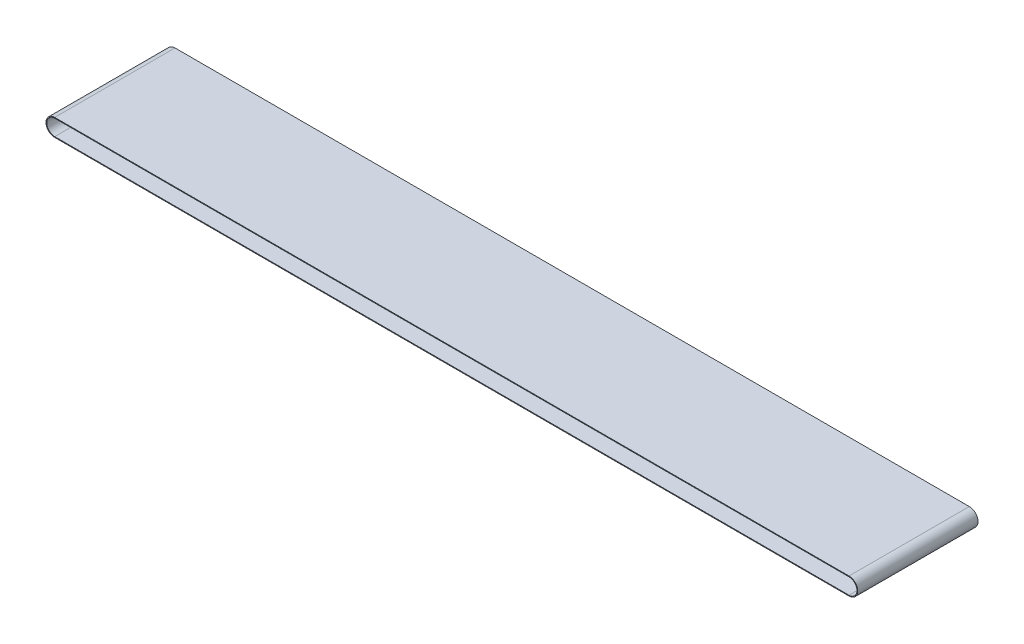
ISO-10303-21;
HEADER;
FILE_DESCRIPTION(('STEP AP214'),'2;1');
FILE_NAME('part.step','',(''),(''),'','','');
FILE_SCHEMA(('AUTOMOTIVE_DESIGN { 1 0 10303 214 1 1 1 1 }'));
ENDSEC;
DATA;
#1=APPLICATION_CONTEXT('core data for automotive mechanical design processes');
#2=APPLICATION_PROTOCOL_DEFINITION('international standard','automotive_design',2000,#1);
#3=PRODUCT_CONTEXT('',#1,'mechanical');
#4=PRODUCT('Part','Part','',(#3));
#5=PRODUCT_RELATED_PRODUCT_CATEGORY('part','',(#4));
#6=PRODUCT_DEFINITION_FORMATION('','',#4);
#7=PRODUCT_DEFINITION_CONTEXT('part definition',#1,'design');
#8=PRODUCT_DEFINITION('design','',#6,#7);
#9=PRODUCT_DEFINITION_SHAPE('','',#8);
#10=(LENGTH_UNIT() NAMED_UNIT(*) SI_UNIT(.MILLI.,.METRE.));
#11=(NAMED_UNIT(*) PLANE_ANGLE_UNIT() SI_UNIT($,.RADIAN.));
#12=(NAMED_UNIT(*) SI_UNIT($,.STERADIAN.) SOLID_ANGLE_UNIT());
#13=UNCERTAINTY_MEASURE_WITH_UNIT(LENGTH_MEASURE(1.E-05),#10,'distance_accuracy_value','');
#14=(GEOMETRIC_REPRESENTATION_CONTEXT(3) GLOBAL_UNCERTAINTY_ASSIGNED_CONTEXT((#13)) GLOBAL_UNIT_ASSIGNED_CONTEXT((#10,
#11,#12)) REPRESENTATION_CONTEXT('',''));
#15=CARTESIAN_POINT('',(0.,0.,0.));
#16=DIRECTION('',(0.,0.,1.));
#17=DIRECTION('',(1.,0.,0.));
#18=AXIS2_PLACEMENT_3D('',#15,#16,#17);
#19=CARTESIAN_POINT('',(-525.,0.,79.5));
#20=DIRECTION('',(0.,0.,1.));
#21=DIRECTION('',(1.,0.,0.));
#22=AXIS2_PLACEMENT_3D('',#19,#20,#21);
#23=PLANE('',#22);
#24=CARTESIAN_POINT('',(-525.,0.,79.5));
#25=DIRECTION('',(0.,0.,1.));
#26=DIRECTION('',(1.,0.,0.));
#27=AXIS2_PLACEMENT_3D('',#24,#25,#26);
#28=CIRCLE('',#27,11.5);
#29=CARTESIAN_POINT('',(-525.,11.5,79.5));
#30=VERTEX_POINT('',#29);
#31=CARTESIAN_POINT('',(-525.,-11.5,79.5));
#32=VERTEX_POINT('',#31);
#33=EDGE_CURVE('E138',#30,#32,#28,.T.);
#34=ORIENTED_EDGE('',*,*,#33,.T.);
#35=DIRECTION('',(1.,0.,0.));
#36=VECTOR('',#35,1.);
#37=CARTESIAN_POINT('',(-525.,-11.5,79.5));
#38=LINE('',#37,#36);
#39=CARTESIAN_POINT('',(525.,-11.5,79.5));
#40=VERTEX_POINT('',#39);
#41=EDGE_CURVE('E141',#32,#40,#38,.T.);
#42=ORIENTED_EDGE('',*,*,#41,.T.);
#43=CARTESIAN_POINT('',(525.,0.,79.5));
#44=DIRECTION('',(0.,0.,1.));
#45=DIRECTION('',(1.,0.,0.));
#46=AXIS2_PLACEMENT_3D('',#43,#44,#45);
#47=CIRCLE('',#46,11.5);
#48=CARTESIAN_POINT('',(525.,11.5,79.5));
#49=VERTEX_POINT('',#48);
#50=EDGE_CURVE('E144',#40,#49,#47,.T.);
#51=ORIENTED_EDGE('',*,*,#50,.T.);
#52=DIRECTION('',(-1.,0.,0.));
#53=VECTOR('',#52,1.);
#54=CARTESIAN_POINT('',(-525.,11.5,79.5));
#55=LINE('',#54,#53);
#56=EDGE_CURVE('E146',#49,#30,#55,.T.);
#57=ORIENTED_EDGE('',*,*,#56,.T.);
#58=EDGE_LOOP('',(#34,#42,#51,#57));
#59=FACE_BOUND('',#58,.T.);
#60=DIRECTION('',(1.,0.,0.));
#61=VECTOR('',#60,1.);
#62=CARTESIAN_POINT('',(-525.,-10.5,79.5));
#63=LINE('',#62,#61);
#64=CARTESIAN_POINT('',(-525.,-10.5,79.5));
#65=VERTEX_POINT('',#64);
#66=CARTESIAN_POINT('',(525.,-10.5,79.5));
#67=VERTEX_POINT('',#66);
#68=EDGE_CURVE('E110',#65,#67,#63,.T.);
#69=ORIENTED_EDGE('',*,*,#68,.F.);
#70=CARTESIAN_POINT('',(-525.,0.,79.5));
#71=DIRECTION('',(0.,0.,1.));
#72=DIRECTION('',(1.,0.,0.));
#73=AXIS2_PLACEMENT_3D('',#70,#71,#72);
#74=CIRCLE('',#73,10.5);
#75=CARTESIAN_POINT('',(-525.,10.5,79.5));
#76=VERTEX_POINT('',#75);
#77=EDGE_CURVE('E102',#76,#65,#74,.T.);
#78=ORIENTED_EDGE('',*,*,#77,.F.);
#79=DIRECTION('',(-1.,0.,0.));
#80=VECTOR('',#79,1.);
#81=CARTESIAN_POINT('',(-525.,10.5,79.5));
#82=LINE('',#81,#80);
#83=CARTESIAN_POINT('',(525.,10.5,79.5));
#84=VERTEX_POINT('',#83);
#85=EDGE_CURVE('E124',#84,#76,#82,.T.);
#86=ORIENTED_EDGE('',*,*,#85,.F.);
#87=CARTESIAN_POINT('',(525.,0.,79.5));
#88=DIRECTION('',(0.,0.,1.));
#89=DIRECTION('',(1.,0.,0.));
#90=AXIS2_PLACEMENT_3D('',#87,#88,#89);
#91=CIRCLE('',#90,10.5);
#92=EDGE_CURVE('E122',#67,#84,#91,.T.);
#93=ORIENTED_EDGE('',*,*,#92,.F.);
#94=EDGE_LOOP('',(#69,#78,#86,#93));
#95=FACE_BOUND('',#94,.T.);
#96=ADVANCED_FACE('F37',(#59,#95),#23,.T.);
#97=CARTESIAN_POINT('',(-525.,0.,-79.5));
#98=DIRECTION('',(0.,0.,1.));
#99=DIRECTION('',(1.,0.,0.));
#100=AXIS2_PLACEMENT_3D('',#97,#98,#99);
#101=PLANE('',#100);
#102=CARTESIAN_POINT('',(-525.,0.,-79.5));
#103=DIRECTION('',(0.,0.,1.));
#104=DIRECTION('',(1.,0.,0.));
#105=AXIS2_PLACEMENT_3D('',#102,#103,#104);
#106=CIRCLE('',#105,11.5);
#107=CARTESIAN_POINT('',(-525.,11.5,-79.5));
#108=VERTEX_POINT('',#107);
#109=CARTESIAN_POINT('',(-525.,-11.5,-79.5));
#110=VERTEX_POINT('',#109);
#111=EDGE_CURVE('E118',#108,#110,#106,.T.);
#112=ORIENTED_EDGE('',*,*,#111,.F.);
#113=DIRECTION('',(-1.,0.,0.));
#114=VECTOR('',#113,1.);
#115=CARTESIAN_POINT('',(-525.,11.5,-79.5));
#116=LINE('',#115,#114);
#117=CARTESIAN_POINT('',(525.,11.5,-79.5));
#118=VERTEX_POINT('',#117);
#119=EDGE_CURVE('E142',#118,#108,#116,.T.);
#120=ORIENTED_EDGE('',*,*,#119,.F.);
#121=CARTESIAN_POINT('',(525.,0.,-79.5));
#122=DIRECTION('',(0.,0.,1.));
#123=DIRECTION('',(1.,0.,0.));
#124=AXIS2_PLACEMENT_3D('',#121,#122,#123);
#125=CIRCLE('',#124,11.5);
#126=CARTESIAN_POINT('',(525.,-11.5,-79.5));
#127=VERTEX_POINT('',#126);
#128=EDGE_CURVE('E153',#127,#118,#125,.T.);
#129=ORIENTED_EDGE('',*,*,#128,.F.);
#130=DIRECTION('',(1.,0.,0.));
#131=VECTOR('',#130,1.);
#132=CARTESIAN_POINT('',(-525.,-11.5,-79.5));
#133=LINE('',#132,#131);
#134=EDGE_CURVE('E151',#110,#127,#133,.T.);
#135=ORIENTED_EDGE('',*,*,#134,.F.);
#136=EDGE_LOOP('',(#112,#120,#129,#135));
#137=FACE_BOUND('',#136,.T.);
#138=CARTESIAN_POINT('',(-525.,0.,-79.5));
#139=DIRECTION('',(0.,0.,1.));
#140=DIRECTION('',(1.,0.,0.));
#141=AXIS2_PLACEMENT_3D('',#138,#139,#140);
#142=CIRCLE('',#141,10.5);
#143=CARTESIAN_POINT('',(-525.,10.5,-79.5));
#144=VERTEX_POINT('',#143);
#145=CARTESIAN_POINT('',(-525.,-10.5,-79.5));
#146=VERTEX_POINT('',#145);
#147=EDGE_CURVE('E60',#144,#146,#142,.T.);
#148=ORIENTED_EDGE('',*,*,#147,.T.);
#149=DIRECTION('',(1.,0.,0.));
#150=VECTOR('',#149,1.);
#151=CARTESIAN_POINT('',(-525.,-10.5,-79.5));
#152=LINE('',#151,#150);
#153=CARTESIAN_POINT('',(525.,-10.5,-79.5));
#154=VERTEX_POINT('',#153);
#155=EDGE_CURVE('E117',#146,#154,#152,.T.);
#156=ORIENTED_EDGE('',*,*,#155,.T.);
#157=CARTESIAN_POINT('',(525.,0.,-79.5));
#158=DIRECTION('',(0.,0.,1.));
#159=DIRECTION('',(1.,0.,0.));
#160=AXIS2_PLACEMENT_3D('',#157,#158,#159);
#161=CIRCLE('',#160,10.5);
#162=CARTESIAN_POINT('',(525.,10.5,-79.5));
#163=VERTEX_POINT('',#162);
#164=EDGE_CURVE('E130',#154,#163,#161,.T.);
#165=ORIENTED_EDGE('',*,*,#164,.T.);
#166=DIRECTION('',(-1.,0.,0.));
#167=VECTOR('',#166,1.);
#168=CARTESIAN_POINT('',(-525.,10.5,-79.5));
#169=LINE('',#168,#167);
#170=EDGE_CURVE('E111',#163,#144,#169,.T.);
#171=ORIENTED_EDGE('',*,*,#170,.T.);
#172=EDGE_LOOP('',(#148,#156,#165,#171));
#173=FACE_BOUND('',#172,.T.);
#174=ADVANCED_FACE('F171',(#137,#173),#101,.F.);
#175=CARTESIAN_POINT('',(-525.,0.,79.5));
#176=DIRECTION('',(0.,0.,-1.));
#177=DIRECTION('',(-1.,0.,0.));
#178=AXIS2_PLACEMENT_3D('',#175,#176,#177);
#179=CYLINDRICAL_SURFACE('',#178,11.5);
#180=ORIENTED_EDGE('',*,*,#111,.T.);
#181=DIRECTION('',(0.,0.,-1.));
#182=VECTOR('',#181,1.);
#183=CARTESIAN_POINT('',(-525.,-11.5,79.5));
#184=LINE('',#183,#182);
#185=EDGE_CURVE('E11',#32,#110,#184,.T.);
#186=ORIENTED_EDGE('',*,*,#185,.F.);
#187=ORIENTED_EDGE('',*,*,#33,.F.);
#188=DIRECTION('',(0.,0.,-1.));
#189=VECTOR('',#188,1.);
#190=CARTESIAN_POINT('',(-525.,11.5,79.5));
#191=LINE('',#190,#189);
#192=EDGE_CURVE('E148',#30,#108,#191,.T.);
#193=ORIENTED_EDGE('',*,*,#192,.T.);
#194=EDGE_LOOP('',(#180,#186,#187,#193));
#195=FACE_BOUND('',#194,.T.);
#196=ADVANCED_FACE('F39',(#195),#179,.T.);
#197=CARTESIAN_POINT('',(-525.,-11.5,79.5));
#198=DIRECTION('',(0.,1.,0.));
#199=DIRECTION('',(0.,0.,1.));
#200=AXIS2_PLACEMENT_3D('',#197,#198,#199);
#201=PLANE('',#200);
#202=ORIENTED_EDGE('',*,*,#134,.T.);
#203=DIRECTION('',(0.,0.,-1.));
#204=VECTOR('',#203,1.);
#205=CARTESIAN_POINT('',(525.,-11.5,79.5));
#206=LINE('',#205,#204);
#207=EDGE_CURVE('E45',#40,#127,#206,.T.);
#208=ORIENTED_EDGE('',*,*,#207,.F.);
#209=ORIENTED_EDGE('',*,*,#41,.F.);
#210=ORIENTED_EDGE('',*,*,#185,.T.);
#211=EDGE_LOOP('',(#202,#208,#209,#210));
#212=FACE_BOUND('',#211,.T.);
#213=ADVANCED_FACE('F181',(#212),#201,.F.);
#214=CARTESIAN_POINT('',(525.,0.,79.5));
#215=DIRECTION('',(0.,0.,-1.));
#216=DIRECTION('',(-1.,0.,0.));
#217=AXIS2_PLACEMENT_3D('',#214,#215,#216);
#218=CYLINDRICAL_SURFACE('',#217,11.5);
#219=ORIENTED_EDGE('',*,*,#128,.T.);
#220=DIRECTION('',(0.,0.,-1.));
#221=VECTOR('',#220,1.);
#222=CARTESIAN_POINT('',(525.,11.5,79.5));
#223=LINE('',#222,#221);
#224=EDGE_CURVE('E158',#49,#118,#223,.T.);
#225=ORIENTED_EDGE('',*,*,#224,.F.);
#226=ORIENTED_EDGE('',*,*,#50,.F.);
#227=ORIENTED_EDGE('',*,*,#207,.T.);
#228=EDGE_LOOP('',(#219,#225,#226,#227));
#229=FACE_BOUND('',#228,.T.);
#230=ADVANCED_FACE('F165',(#229),#218,.T.);
#231=CARTESIAN_POINT('',(-525.,11.5,79.5));
#232=DIRECTION('',(0.,-1.,0.));
#233=DIRECTION('',(0.,0.,-1.));
#234=AXIS2_PLACEMENT_3D('',#231,#232,#233);
#235=PLANE('',#234);
#236=ORIENTED_EDGE('',*,*,#119,.T.);
#237=ORIENTED_EDGE('',*,*,#192,.F.);
#238=ORIENTED_EDGE('',*,*,#56,.F.);
#239=ORIENTED_EDGE('',*,*,#224,.T.);
#240=EDGE_LOOP('',(#236,#237,#238,#239));
#241=FACE_BOUND('',#240,.T.);
#242=ADVANCED_FACE('F175',(#241),#235,.F.);
#243=CARTESIAN_POINT('',(-525.,0.,79.5));
#244=DIRECTION('',(0.,0.,-1.));
#245=DIRECTION('',(-1.,0.,0.));
#246=AXIS2_PLACEMENT_3D('',#243,#244,#245);
#247=CYLINDRICAL_SURFACE('',#246,10.5);
#248=ORIENTED_EDGE('',*,*,#147,.F.);
#249=DIRECTION('',(0.,0.,-1.));
#250=VECTOR('',#249,1.);
#251=CARTESIAN_POINT('',(-525.,10.5,79.5));
#252=LINE('',#251,#250);
#253=EDGE_CURVE('E106',#76,#144,#252,.T.);
#254=ORIENTED_EDGE('',*,*,#253,.F.);
#255=ORIENTED_EDGE('',*,*,#77,.T.);
#256=DIRECTION('',(0.,0.,-1.));
#257=VECTOR('',#256,1.);
#258=CARTESIAN_POINT('',(-525.,-10.5,79.5));
#259=LINE('',#258,#257);
#260=EDGE_CURVE('E105',#65,#146,#259,.T.);
#261=ORIENTED_EDGE('',*,*,#260,.T.);
#262=EDGE_LOOP('',(#248,#254,#255,#261));
#263=FACE_BOUND('',#262,.T.);
#264=ADVANCED_FACE('F104',(#263),#247,.F.);
#265=CARTESIAN_POINT('',(-525.,-10.5,79.5));
#266=DIRECTION('',(0.,1.,0.));
#267=DIRECTION('',(-1.,0.,0.));
#268=AXIS2_PLACEMENT_3D('',#265,#266,#267);
#269=PLANE('',#268);
#270=ORIENTED_EDGE('',*,*,#155,.F.);
#271=ORIENTED_EDGE('',*,*,#260,.F.);
#272=ORIENTED_EDGE('',*,*,#68,.T.);
#273=DIRECTION('',(0.,0.,-1.));
#274=VECTOR('',#273,1.);
#275=CARTESIAN_POINT('',(525.,-10.5,79.5));
#276=LINE('',#275,#274);
#277=EDGE_CURVE('E119',#67,#154,#276,.T.);
#278=ORIENTED_EDGE('',*,*,#277,.T.);
#279=EDGE_LOOP('',(#270,#271,#272,#278));
#280=FACE_BOUND('',#279,.T.);
#281=ADVANCED_FACE('F114',(#280),#269,.T.);
#282=CARTESIAN_POINT('',(525.,0.,79.5));
#283=DIRECTION('',(0.,0.,-1.));
#284=DIRECTION('',(-1.,0.,0.));
#285=AXIS2_PLACEMENT_3D('',#282,#283,#284);
#286=CYLINDRICAL_SURFACE('',#285,10.5);
#287=ORIENTED_EDGE('',*,*,#164,.F.);
#288=ORIENTED_EDGE('',*,*,#277,.F.);
#289=ORIENTED_EDGE('',*,*,#92,.T.);
#290=DIRECTION('',(0.,0.,-1.));
#291=VECTOR('',#290,1.);
#292=CARTESIAN_POINT('',(525.,10.5,79.5));
#293=LINE('',#292,#291);
#294=EDGE_CURVE('E52',#84,#163,#293,.T.);
#295=ORIENTED_EDGE('',*,*,#294,.T.);
#296=EDGE_LOOP('',(#287,#288,#289,#295));
#297=FACE_BOUND('',#296,.T.);
#298=ADVANCED_FACE('F204',(#297),#286,.F.);
#299=CARTESIAN_POINT('',(-525.,10.5,79.5));
#300=DIRECTION('',(0.,-1.,0.));
#301=DIRECTION('',(0.,0.,-1.));
#302=AXIS2_PLACEMENT_3D('',#299,#300,#301);
#303=PLANE('',#302);
#304=ORIENTED_EDGE('',*,*,#170,.F.);
#305=ORIENTED_EDGE('',*,*,#294,.F.);
#306=ORIENTED_EDGE('',*,*,#85,.T.);
#307=ORIENTED_EDGE('',*,*,#253,.T.);
#308=EDGE_LOOP('',(#304,#305,#306,#307));
#309=FACE_BOUND('',#308,.T.);
#310=ADVANCED_FACE('F208',(#309),#303,.T.);
#311=CLOSED_SHELL('',(#96,#174,#196,#213,#230,#242,#264,#281,#298,#310));
#312=MANIFOLD_SOLID_BREP('B2',#311);
#313=ADVANCED_BREP_SHAPE_REPRESENTATION('',(#18,#312),#14);
#314=SHAPE_DEFINITION_REPRESENTATION(#9,#313);
ENDSEC;
END-ISO-10303-21;
